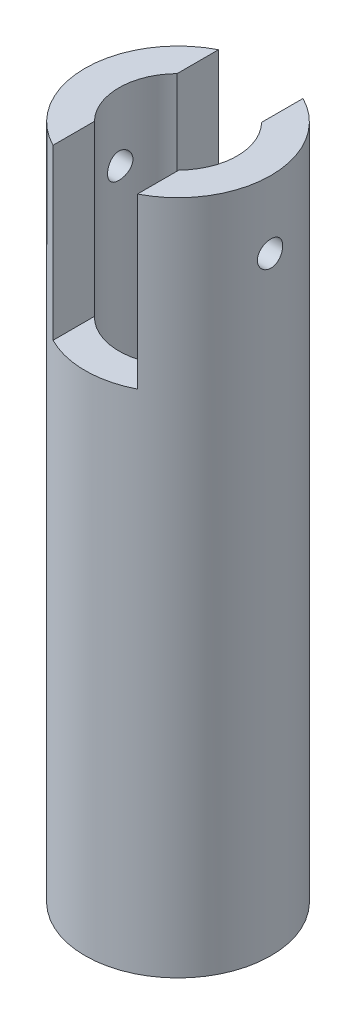
ISO-10303-21;
HEADER;
FILE_DESCRIPTION(('STEP AP214'),'2;1');
FILE_NAME('part.step','',(''),(''),'','','');
FILE_SCHEMA(('AUTOMOTIVE_DESIGN { 1 0 10303 214 1 1 1 1 }'));
ENDSEC;
DATA;
#1=APPLICATION_CONTEXT('core data for automotive mechanical design processes');
#2=APPLICATION_PROTOCOL_DEFINITION('international standard','automotive_design',2000,#1);
#3=PRODUCT_CONTEXT('',#1,'mechanical');
#4=PRODUCT('Part','Part','',(#3));
#5=PRODUCT_RELATED_PRODUCT_CATEGORY('part','',(#4));
#6=PRODUCT_DEFINITION_FORMATION('','',#4);
#7=PRODUCT_DEFINITION_CONTEXT('part definition',#1,'design');
#8=PRODUCT_DEFINITION('design','',#6,#7);
#9=PRODUCT_DEFINITION_SHAPE('','',#8);
#10=(LENGTH_UNIT() NAMED_UNIT(*) SI_UNIT(.MILLI.,.METRE.));
#11=(NAMED_UNIT(*) PLANE_ANGLE_UNIT() SI_UNIT($,.RADIAN.));
#12=(NAMED_UNIT(*) SI_UNIT($,.STERADIAN.) SOLID_ANGLE_UNIT());
#13=UNCERTAINTY_MEASURE_WITH_UNIT(LENGTH_MEASURE(1.E-05),#10,'distance_accuracy_value','');
#14=(GEOMETRIC_REPRESENTATION_CONTEXT(3) GLOBAL_UNCERTAINTY_ASSIGNED_CONTEXT((#13)) GLOBAL_UNIT_ASSIGNED_CONTEXT((#10,
#11,#12)) REPRESENTATION_CONTEXT('',''));
#15=CARTESIAN_POINT('',(0.,0.,0.));
#16=DIRECTION('',(0.,0.,1.));
#17=DIRECTION('',(1.,0.,0.));
#18=AXIS2_PLACEMENT_3D('',#15,#16,#17);
#19=CARTESIAN_POINT('',(0.,40.,0.));
#20=DIRECTION('',(0.,-1.,0.));
#21=DIRECTION('',(0.,0.,-1.));
#22=AXIS2_PLACEMENT_3D('',#19,#20,#21);
#23=CYLINDRICAL_SURFACE('',#22,5.5);
#24=CARTESIAN_POINT('',(-5.44862367942584,36.,0.75));
#25=CARTESIAN_POINT('',(-5.44862432821228,36.0419171639454,0.749998238494786));
#26=CARTESIAN_POINT('',(-5.44911262094868,36.0838597213838,0.746474033793942));
#27=CARTESIAN_POINT('',(-5.45101204241061,36.1665752373423,0.732472326567085));
#28=CARTESIAN_POINT('',(-5.45242410767666,36.2073469650124,0.721987767323877));
#29=CARTESIAN_POINT('',(-5.45600823054313,36.2865113927571,0.694382214066334));
#30=CARTESIAN_POINT('',(-5.45817974310622,36.3249057757975,0.677265978501395));
#31=CARTESIAN_POINT('',(-5.46303743390169,36.3982709843737,0.636893590754142));
#32=CARTESIAN_POINT('',(-5.46572353156943,36.4332423445327,0.6136383994859));
#33=CARTESIAN_POINT('',(-5.4713276859861,36.4990072974926,0.561483153875197));
#34=CARTESIAN_POINT('',(-5.47424702406619,36.5297748801679,0.532550436012088));
#35=CARTESIAN_POINT('',(-5.47997724063161,36.5860339028428,0.469931862967251));
#36=CARTESIAN_POINT('',(-5.48278811347474,36.6115250686712,0.436245760944884));
#37=CARTESIAN_POINT('',(-5.48799794558333,36.6566022024483,0.364911683410708));
#38=CARTESIAN_POINT('',(-5.49039523330412,36.676164438286,0.327248578727866));
#39=CARTESIAN_POINT('',(-5.49449365219496,36.7086762840544,0.24913338990555));
#40=CARTESIAN_POINT('',(-5.49619481391624,36.7216261841903,0.208681428253149));
#41=CARTESIAN_POINT('',(-5.49870027402042,36.740467515983,0.126403756906851));
#42=CARTESIAN_POINT('',(-5.49951008477627,36.7464023479257,0.0845881563006048));
#43=CARTESIAN_POINT('',(-5.50016045400814,36.751179690482,0.000547254974664131));
#44=CARTESIAN_POINT('',(-5.50000105743634,36.7500225300248,-0.0416780266531836));
#45=CARTESIAN_POINT('',(-5.49873540733172,36.7406832862068,-0.125044033523871));
#46=CARTESIAN_POINT('',(-5.49763544605483,36.7325478852421,-0.166190097475307));
#47=CARTESIAN_POINT('',(-5.49461929041563,36.7095561994921,-0.246527492164893));
#48=CARTESIAN_POINT('',(-5.49270307809629,36.6946997668479,-0.285718779877973));
#49=CARTESIAN_POINT('',(-5.48825888114084,36.6586388987551,-0.361177250541707));
#50=CARTESIAN_POINT('',(-5.48572897741787,36.6374144996032,-0.397434775412503));
#51=CARTESIAN_POINT('',(-5.48033997739527,36.5892347252735,-0.46589116485084));
#52=CARTESIAN_POINT('',(-5.47748086315112,36.5622790376287,-0.498089807977671));
#53=CARTESIAN_POINT('',(-5.47172549288364,36.5031409970398,-0.557789097807124));
#54=CARTESIAN_POINT('',(-5.4688291238894,36.4709179262455,-0.585249414208928));
#55=CARTESIAN_POINT('',(-5.46334851083837,36.4022990203316,-0.634378465191468));
#56=CARTESIAN_POINT('',(-5.46076426812632,36.3659031672356,-0.656047174820568));
#57=CARTESIAN_POINT('',(-5.4562005774764,36.2899332745995,-0.692981572825315));
#58=CARTESIAN_POINT('',(-5.45422147211024,36.2503574508078,-0.708243636178043));
#59=CARTESIAN_POINT('',(-5.45109853836438,36.1691714847138,-0.731893674041885));
#60=CARTESIAN_POINT('',(-5.44995466175976,36.1275614600113,-0.740282045433559));
#61=CARTESIAN_POINT('',(-5.44864067222812,36.0438455782465,-0.749892354180297));
#62=CARTESIAN_POINT('',(-5.44846282324423,36.0017463741903,-0.751171227137242));
#63=CARTESIAN_POINT('',(-5.44908053291778,35.9179342910334,-0.746676830732748));
#64=CARTESIAN_POINT('',(-5.4498760667662,35.876221402114,-0.740903741107735));
#65=CARTESIAN_POINT('',(-5.45234382679086,35.7945391337106,-0.722517388634435));
#66=CARTESIAN_POINT('',(-5.45401247449059,35.7545633536269,-0.709932038780938));
#67=CARTESIAN_POINT('',(-5.45803552731522,35.6772891376851,-0.678307280784331));
#68=CARTESIAN_POINT('',(-5.46038996081854,35.6399908127021,-0.659267605550156));
#69=CARTESIAN_POINT('',(-5.46553770194495,35.5688736968887,-0.615136060523287));
#70=CARTESIAN_POINT('',(-5.46833366386318,35.5350781419368,-0.590007061362654));
#71=CARTESIAN_POINT('',(-5.4740412458354,35.4721637487828,-0.534462296366743));
#72=CARTESIAN_POINT('',(-5.47695287125968,35.4430451280496,-0.504046284831928));
#73=CARTESIAN_POINT('',(-5.48258766100113,35.3901092365953,-0.43854129372568));
#74=CARTESIAN_POINT('',(-5.48530940289262,35.3663295177688,-0.403421827621339));
#75=CARTESIAN_POINT('',(-5.49023614004829,35.3250070554806,-0.329653908910437));
#76=CARTESIAN_POINT('',(-5.49244114738441,35.3074641663095,-0.291005538775303));
#77=CARTESIAN_POINT('',(-5.49607969494058,35.2791744870357,-0.211398404265973));
#78=CARTESIAN_POINT('',(-5.49751563888312,35.2684065031768,-0.170447285887151));
#79=CARTESIAN_POINT('',(-5.49946429827437,35.2539034961619,-0.0872972814052518));
#80=CARTESIAN_POINT('',(-5.4999770636871,35.2501680923902,-0.0450984629555074));
#81=CARTESIAN_POINT('',(-5.50002124174464,35.2498443336144,0.0389834861984452));
#82=CARTESIAN_POINT('',(-5.4995605780852,35.2531982715587,0.0808664021367507));
#83=CARTESIAN_POINT('',(-5.49772550186329,35.2668351328193,0.163467131876106));
#84=CARTESIAN_POINT('',(-5.4963510908427,35.2771180444435,0.204184947643066));
#85=CARTESIAN_POINT('',(-5.49284222198332,35.3043017963978,0.283288469414655));
#86=CARTESIAN_POINT('',(-5.49070814360522,35.3211993330825,0.321675328567206));
#87=CARTESIAN_POINT('',(-5.4859154179771,35.3611266511202,0.395077898212851));
#88=CARTESIAN_POINT('',(-5.48325675974811,35.3841565608219,0.430093538126579));
#89=CARTESIAN_POINT('',(-5.47768532661291,35.4359063933612,0.496053682151111));
#90=CARTESIAN_POINT('',(-5.47477073786026,35.4646691339803,0.526964442343851));
#91=CARTESIAN_POINT('',(-5.46903000129062,35.5269784389954,0.583542371196155));
#92=CARTESIAN_POINT('',(-5.46620387448299,35.5605261294432,0.609208302111163));
#93=CARTESIAN_POINT('',(-5.46094615595882,35.631632423343,0.654671533451965));
#94=CARTESIAN_POINT('',(-5.45851643956207,35.6692087729144,0.674441285541157));
#95=CARTESIAN_POINT('',(-5.45434859208448,35.747161896175,0.707360730002458));
#96=CARTESIAN_POINT('',(-5.45260972408103,35.7875356316144,0.720517480406806));
#97=CARTESIAN_POINT('',(-5.45043388216463,35.8567556991195,0.736758008064999));
#98=CARTESIAN_POINT('',(-5.44975853008098,35.8851691055984,0.7417164194638));
#99=CARTESIAN_POINT('',(-5.44885320789078,35.9423843442811,0.748338004828136));
#100=CARTESIAN_POINT('',(-5.44862323345052,35.9711861727027,0.750001210857374));
#101=CARTESIAN_POINT('',(-5.44862367942584,36.,0.75));
#102=B_SPLINE_CURVE_WITH_KNOTS('',3,(#24,#25,#26,#27,#28,#29,#30,#31,#32,#33,#34,#35,#36,#37,
#38,#39,#40,#41,#42,#43,#44,#45,#46,#47,#48,#49,#50,#51,#52,#53,#54,#55,#56,#57,#58,#59,#60,#61,
#62,#63,#64,#65,#66,#67,#68,#69,#70,#71,#72,#73,#74,#75,#76,#77,#78,#79,#80,#81,#82,#83,#84,#85,
#86,#87,#88,#89,#90,#91,#92,#93,#94,#95,#96,#97,#98,#99,#100,#101),.UNSPECIFIED.,.T.,.F.,(4,2,2,
2,2,2,2,2,2,2,2,2,2,2,2,2,2,2,2,2,2,2,2,2,2,2,2,2,2,2,2,2,2,2,2,2,2,2,4),(0.,0.125646206826185,
0.25141999430737,0.377103701527226,0.502767747470541,0.629177150874036,0.755593121066162,
0.882508617622696,1.00941854357567,1.13553913352513,1.26165387399972,1.38693146536708,
1.51221181290698,1.6378890953218,1.7635732313566,1.89027935655859,2.0169860276323,
2.14376429583517,2.27053524346326,2.39628948188411,2.52204051521907,2.64728014611423,
2.77252496027315,2.89855356459824,3.02458802732691,3.15148298083582,3.27837496953451,
3.40486800549967,3.5313541952376,3.65681475740462,3.78227510786556,3.90767287748694,
4.03307327184753,4.15944795111646,4.28585241960836,4.41283854629708,4.53968885183256,
4.62605880130635,4.71242791036092),.UNSPECIFIED.);
#103=CARTESIAN_POINT('',(-5.44862367942584,36.,0.75));
#104=VERTEX_POINT('',#103);
#105=EDGE_CURVE('E183',#104,#104,#102,.T.);
#106=ORIENTED_EDGE('',*,*,#105,.F.);
#107=EDGE_LOOP('',(#106));
#108=FACE_BOUND('',#107,.T.);
#109=CARTESIAN_POINT('',(0.,0.,0.));
#110=DIRECTION('',(0.,1.,0.));
#111=DIRECTION('',(0.,0.,1.));
#112=AXIS2_PLACEMENT_3D('',#109,#110,#111);
#113=CIRCLE('',#112,5.5);
#114=CARTESIAN_POINT('',(0.,0.,5.5));
#115=VERTEX_POINT('',#114);
#116=EDGE_CURVE('E146',#115,#115,#113,.T.);
#117=ORIENTED_EDGE('',*,*,#116,.T.);
#118=EDGE_LOOP('',(#117));
#119=FACE_BOUND('',#118,.T.);
#120=DIRECTION('',(0.,-1.,0.));
#121=VECTOR('',#120,1.);
#122=CARTESIAN_POINT('',(2.5,40.,-4.89897948556636));
#123=LINE('',#122,#121);
#124=CARTESIAN_POINT('',(2.5,40.,-4.89897948556636));
#125=VERTEX_POINT('',#124);
#126=CARTESIAN_POINT('',(2.5,30.,-4.89897948556636));
#127=VERTEX_POINT('',#126);
#128=EDGE_CURVE('E140',#125,#127,#123,.T.);
#129=ORIENTED_EDGE('',*,*,#128,.F.);
#130=CARTESIAN_POINT('',(0.,40.,0.));
#131=DIRECTION('',(0.,1.,0.));
#132=DIRECTION('',(0.,0.,1.));
#133=AXIS2_PLACEMENT_3D('',#130,#131,#132);
#134=CIRCLE('',#133,5.5);
#135=CARTESIAN_POINT('',(2.5,40.,4.89897948556636));
#136=VERTEX_POINT('',#135);
#137=EDGE_CURVE('E150',#136,#125,#134,.T.);
#138=ORIENTED_EDGE('',*,*,#137,.F.);
#139=DIRECTION('',(0.,-1.,0.));
#140=VECTOR('',#139,1.);
#141=CARTESIAN_POINT('',(2.5,40.,4.89897948556636));
#142=LINE('',#141,#140);
#143=CARTESIAN_POINT('',(2.5,30.,4.89897948556636));
#144=VERTEX_POINT('',#143);
#145=EDGE_CURVE('E137',#144,#136,#142,.F.);
#146=ORIENTED_EDGE('',*,*,#145,.F.);
#147=CARTESIAN_POINT('',(0.,30.,0.));
#148=DIRECTION('',(0.,-1.,0.));
#149=DIRECTION('',(0.,0.,-1.));
#150=AXIS2_PLACEMENT_3D('',#147,#148,#149);
#151=CIRCLE('',#150,5.5);
#152=CARTESIAN_POINT('',(-2.50000000000001,30.,4.89897948556635));
#153=VERTEX_POINT('',#152);
#154=EDGE_CURVE('E116',#144,#153,#151,.T.);
#155=ORIENTED_EDGE('',*,*,#154,.T.);
#156=DIRECTION('',(0.,-1.,0.));
#157=VECTOR('',#156,1.);
#158=CARTESIAN_POINT('',(-2.50000000000001,40.,4.89897948556635));
#159=LINE('',#158,#157);
#160=CARTESIAN_POINT('',(-2.50000000000001,40.,4.89897948556635));
#161=VERTEX_POINT('',#160);
#162=EDGE_CURVE('E129',#153,#161,#159,.F.);
#163=ORIENTED_EDGE('',*,*,#162,.T.);
#164=CARTESIAN_POINT('',(-2.50000000000001,40.,-4.89897948556635));
#165=VERTEX_POINT('',#164);
#166=EDGE_CURVE('E127',#165,#161,#134,.T.);
#167=ORIENTED_EDGE('',*,*,#166,.F.);
#168=DIRECTION('',(0.,-1.,0.));
#169=VECTOR('',#168,1.);
#170=CARTESIAN_POINT('',(-2.50000000000001,40.,-4.89897948556635));
#171=LINE('',#170,#169);
#172=CARTESIAN_POINT('',(-2.50000000000001,30.,-4.89897948556635));
#173=VERTEX_POINT('',#172);
#174=EDGE_CURVE('E117',#165,#173,#171,.T.);
#175=ORIENTED_EDGE('',*,*,#174,.T.);
#176=EDGE_CURVE('E106',#173,#127,#151,.T.);
#177=ORIENTED_EDGE('',*,*,#176,.T.);
#178=EDGE_LOOP('',(#129,#138,#146,#155,#163,#167,#175,#177));
#179=FACE_BOUND('',#178,.T.);
#180=CARTESIAN_POINT('',(5.44862367942584,36.,0.75));
#181=CARTESIAN_POINT('',(5.44862432821228,35.9580828360546,0.749998238494786));
#182=CARTESIAN_POINT('',(5.44911262094868,35.9161402786163,0.746474033793942));
#183=CARTESIAN_POINT('',(5.45101204241061,35.8334247626577,0.732472326567085));
#184=CARTESIAN_POINT('',(5.45242410767666,35.7926530349876,0.721987767323877));
#185=CARTESIAN_POINT('',(5.45600823054313,35.7134886072429,0.694382214066334));
#186=CARTESIAN_POINT('',(5.45817974310622,35.6750942242025,0.677265978501395));
#187=CARTESIAN_POINT('',(5.46303743390169,35.6017290156263,0.636893590754142));
#188=CARTESIAN_POINT('',(5.46572353156943,35.5667576554673,0.613638399485901));
#189=CARTESIAN_POINT('',(5.4713276859861,35.5009927025074,0.561483153875196));
#190=CARTESIAN_POINT('',(5.47424702406619,35.4702251198321,0.532550436012085));
#191=CARTESIAN_POINT('',(5.47997724063161,35.4139660971572,0.469931862967248));
#192=CARTESIAN_POINT('',(5.48278811347474,35.3884749313288,0.436245760944882));
#193=CARTESIAN_POINT('',(5.48799794558333,35.3433977975517,0.364911683410709));
#194=CARTESIAN_POINT('',(5.49039523330412,35.323835561714,0.327248578727867));
#195=CARTESIAN_POINT('',(5.49449365219496,35.2913237159456,0.24913338990555));
#196=CARTESIAN_POINT('',(5.49619481391624,35.2783738158097,0.208681428253149));
#197=CARTESIAN_POINT('',(5.49870027402042,35.259532484017,0.12640375690685));
#198=CARTESIAN_POINT('',(5.49951008477627,35.2535976520743,0.0845881563006046));
#199=CARTESIAN_POINT('',(5.50016045400814,35.248820309518,0.00054725497466386));
#200=CARTESIAN_POINT('',(5.50000105743634,35.2499774699752,-0.0416780266531837));
#201=CARTESIAN_POINT('',(5.49873540733172,35.2593167137932,-0.125044033523871));
#202=CARTESIAN_POINT('',(5.49763544605483,35.2674521147579,-0.166190097475307));
#203=CARTESIAN_POINT('',(5.49461929041563,35.2904438005079,-0.246527492164893));
#204=CARTESIAN_POINT('',(5.49270307809629,35.3053002331521,-0.285718779877973));
#205=CARTESIAN_POINT('',(5.48825888114084,35.3413611012449,-0.361177250541707));
#206=CARTESIAN_POINT('',(5.48572897741787,35.3625855003968,-0.397434775412503));
#207=CARTESIAN_POINT('',(5.48033997739527,35.4107652747265,-0.46589116485084));
#208=CARTESIAN_POINT('',(5.47748086315112,35.4377209623713,-0.498089807977671));
#209=CARTESIAN_POINT('',(5.47172549288364,35.4968590029602,-0.557789097807124));
#210=CARTESIAN_POINT('',(5.4688291238894,35.5290820737545,-0.585249414208928));
#211=CARTESIAN_POINT('',(5.46334851083837,35.5977009796684,-0.634378465191468));
#212=CARTESIAN_POINT('',(5.46076426812632,35.6340968327644,-0.656047174820568));
#213=CARTESIAN_POINT('',(5.4562005774764,35.7100667254005,-0.692981572825315));
#214=CARTESIAN_POINT('',(5.45422147211024,35.7496425491922,-0.708243636178043));
#215=CARTESIAN_POINT('',(5.45109853836438,35.8308285152862,-0.731893674041885));
#216=CARTESIAN_POINT('',(5.44995466175976,35.8724385399887,-0.740282045433559));
#217=CARTESIAN_POINT('',(5.44864067222812,35.9561544217535,-0.749892354180297));
#218=CARTESIAN_POINT('',(5.44846282324423,35.9982536258098,-0.751171227137242));
#219=CARTESIAN_POINT('',(5.44908053291778,36.0820657089666,-0.746676830732748));
#220=CARTESIAN_POINT('',(5.4498760667662,36.123778597886,-0.740903741107735));
#221=CARTESIAN_POINT('',(5.45234382679086,36.2054608662894,-0.722517388634435));
#222=CARTESIAN_POINT('',(5.45401247449059,36.2454366463731,-0.709932038780937));
#223=CARTESIAN_POINT('',(5.45803552731522,36.3227108623149,-0.678307280784331));
#224=CARTESIAN_POINT('',(5.46038996081853,36.3600091872979,-0.659267605550156));
#225=CARTESIAN_POINT('',(5.46553770194495,36.4311263031114,-0.615136060523288));
#226=CARTESIAN_POINT('',(5.46833366386318,36.4649218580632,-0.590007061362656));
#227=CARTESIAN_POINT('',(5.4740412458354,36.5278362512172,-0.534462296366745));
#228=CARTESIAN_POINT('',(5.47695287125968,36.5569548719504,-0.50404628483193));
#229=CARTESIAN_POINT('',(5.48258766100113,36.6098907634047,-0.438541293725679));
#230=CARTESIAN_POINT('',(5.48530940289262,36.6336704822312,-0.403421827621336));
#231=CARTESIAN_POINT('',(5.49023614004829,36.6749929445194,-0.329653908910433));
#232=CARTESIAN_POINT('',(5.49244114738441,36.6925358336905,-0.291005538775301));
#233=CARTESIAN_POINT('',(5.49607969494058,36.7208255129643,-0.211398404265972));
#234=CARTESIAN_POINT('',(5.49751563888312,36.7315934968232,-0.170447285887151));
#235=CARTESIAN_POINT('',(5.49946429827437,36.7460965038381,-0.0872972814052519));
#236=CARTESIAN_POINT('',(5.4999770636871,36.7498319076098,-0.0450984629555075));
#237=CARTESIAN_POINT('',(5.50002124174464,36.7501556663856,0.0389834861984452));
#238=CARTESIAN_POINT('',(5.4995605780852,36.7468017284414,0.0808664021367507));
#239=CARTESIAN_POINT('',(5.49772550186329,36.7331648671807,0.163467131876106));
#240=CARTESIAN_POINT('',(5.4963510908427,36.7228819555565,0.204184947643066));
#241=CARTESIAN_POINT('',(5.49284222198332,36.6956982036022,0.283288469414654));
#242=CARTESIAN_POINT('',(5.49070814360522,36.6788006669176,0.321675328567204));
#243=CARTESIAN_POINT('',(5.4859154179771,36.6388733488798,0.395077898212849));
#244=CARTESIAN_POINT('',(5.48325675974811,36.6158434391781,0.430093538126579));
#245=CARTESIAN_POINT('',(5.47768532661291,36.5640936066388,0.496053682151112));
#246=CARTESIAN_POINT('',(5.47477073786026,36.5353308660197,0.526964442343853));
#247=CARTESIAN_POINT('',(5.46903000129062,36.4730215610046,0.583542371196157));
#248=CARTESIAN_POINT('',(5.46620387448299,36.4394738705568,0.609208302111164));
#249=CARTESIAN_POINT('',(5.46094615595882,36.368367576657,0.654671533451966));
#250=CARTESIAN_POINT('',(5.45851643956207,36.3307912270856,0.674441285541157));
#251=CARTESIAN_POINT('',(5.45434859208448,36.252838103825,0.707360730002458));
#252=CARTESIAN_POINT('',(5.45260972408103,36.2124643683856,0.720517480406806));
#253=CARTESIAN_POINT('',(5.45043388216463,36.1432443008806,0.736758008064999));
#254=CARTESIAN_POINT('',(5.44975853008098,36.1148308944016,0.7417164194638));
#255=CARTESIAN_POINT('',(5.44885320789078,36.0576156557189,0.748338004828136));
#256=CARTESIAN_POINT('',(5.44862323345052,36.0288138272974,0.750001210857374));
#257=CARTESIAN_POINT('',(5.44862367942584,36.,0.75));
#258=B_SPLINE_CURVE_WITH_KNOTS('',3,(#180,#181,#182,#183,#184,#185,#186,#187,#188,#189,#190,
#191,#192,#193,#194,#195,#196,#197,#198,#199,#200,#201,#202,#203,#204,#205,#206,#207,#208,#209,
#210,#211,#212,#213,#214,#215,#216,#217,#218,#219,#220,#221,#222,#223,#224,#225,#226,#227,#228,
#229,#230,#231,#232,#233,#234,#235,#236,#237,#238,#239,#240,#241,#242,#243,#244,#245,#246,#247,
#248,#249,#250,#251,#252,#253,#254,#255,#256,#257),.UNSPECIFIED.,.T.,.F.,(4,2,2,2,2,2,2,2,2,2,2,
2,2,2,2,2,2,2,2,2,2,2,2,2,2,2,2,2,2,2,2,2,2,2,2,2,2,2,4),(0.,0.125646206826185,0.25141999430737,
0.377103701527226,0.502767747470541,0.629177150874038,0.755593121066161,0.882508617622696,
1.00941854357567,1.13553913352513,1.26165387399972,1.38693146536708,1.51221181290698,
1.6378890953218,1.7635732313566,1.89027935655859,2.0169860276323,2.14376429583517,
2.27053524346326,2.3962894818841,2.52204051521907,2.64728014611423,2.77252496027315,
2.89855356459823,3.02458802732691,3.15148298083583,3.27837496953451,3.40486800549967,
3.5313541952376,3.65681475740461,3.78227510786556,3.90767287748693,4.03307327184753,
4.15944795111646,4.28585241960836,4.41283854629708,4.53968885183256,4.62605880130635,
4.71242791036092),.UNSPECIFIED.);
#259=CARTESIAN_POINT('',(5.44862367942584,36.,0.75));
#260=VERTEX_POINT('',#259);
#261=EDGE_CURVE('E187',#260,#260,#258,.T.);
#262=ORIENTED_EDGE('',*,*,#261,.F.);
#263=EDGE_LOOP('',(#262));
#264=FACE_BOUND('',#263,.T.);
#265=ADVANCED_FACE('F34',(#108,#119,#179,#264),#23,.T.);
#266=CARTESIAN_POINT('',(0.,40.,0.));
#267=DIRECTION('',(0.,-1.,0.));
#268=DIRECTION('',(0.,0.,-1.));
#269=AXIS2_PLACEMENT_3D('',#266,#267,#268);
#270=CYLINDRICAL_SURFACE('',#269,3.5);
#271=CARTESIAN_POINT('',(-3.41869858279434,36.,0.75));
#272=CARTESIAN_POINT('',(-3.41869942294351,36.0416055762336,0.749998541194088));
#273=CARTESIAN_POINT('',(-3.41946636233665,36.0832288869482,0.746526181228762));
#274=CARTESIAN_POINT('',(-3.42244589278789,36.1652933360997,0.732742796269729));
#275=CARTESIAN_POINT('',(-3.42465955623036,36.2057335743339,0.722426698268707));
#276=CARTESIAN_POINT('',(-3.43027057629631,36.2842328747946,0.695294318421271));
#277=CARTESIAN_POINT('',(-3.43366666358336,36.3222944390628,0.678485004956109));
#278=CARTESIAN_POINT('',(-3.44125835428899,36.3950576369703,0.638863088367165));
#279=CARTESIAN_POINT('',(-3.44545393440007,36.429759368514,0.616050660244003));
#280=CARTESIAN_POINT('',(-3.45424789397074,36.4953814807416,0.564675712850976));
#281=CARTESIAN_POINT('',(-3.45885124935541,36.5262394381201,0.536034297419878));
#282=CARTESIAN_POINT('',(-3.46789845855534,36.5827517772028,0.47398475406482));
#283=CARTESIAN_POINT('',(-3.47234230025799,36.60840576443,0.440576265108845));
#284=CARTESIAN_POINT('',(-3.48062384554625,36.6540277222458,0.369523644232281));
#285=CARTESIAN_POINT('',(-3.4844549940969,36.6739358278853,0.331840244114973));
#286=CARTESIAN_POINT('',(-3.49102335521491,36.7071138457231,0.2535671346713));
#287=CARTESIAN_POINT('',(-3.49376068551671,36.7203844723931,0.212977738690157));
#288=CARTESIAN_POINT('',(-3.49779782640584,36.7397149854657,0.130693593835755));
#289=CARTESIAN_POINT('',(-3.49911866689191,36.7458804642762,0.0890247002984614));
#290=CARTESIAN_POINT('',(-3.50024681103503,36.7511556386566,0.0052244726533221));
#291=CARTESIAN_POINT('',(-3.5000542811635,36.7502661102804,-0.0369068100823801));
#292=CARTESIAN_POINT('',(-3.49819350431279,36.7415355176682,-0.119708514625257));
#293=CARTESIAN_POINT('',(-3.49654941576216,36.733808249855,-0.160391557681057));
#294=CARTESIAN_POINT('',(-3.49199770794552,36.7118026590741,-0.239869731989196));
#295=CARTESIAN_POINT('',(-3.48909003308259,36.6975240478501,-0.278664780087528));
#296=CARTESIAN_POINT('',(-3.48229877323429,36.6627192705557,-0.353583748778279));
#297=CARTESIAN_POINT('',(-3.47840842901973,36.6421496163978,-0.389686828507899));
#298=CARTESIAN_POINT('',(-3.47007896871932,36.5953790159182,-0.457970463281427));
#299=CARTESIAN_POINT('',(-3.46563978072347,36.5691773313498,-0.490150503225766));
#300=CARTESIAN_POINT('',(-3.45659663230462,36.5112657277361,-0.550351044000991));
#301=CARTESIAN_POINT('',(-3.45199115186426,36.4794562103215,-0.578275586601254));
#302=CARTESIAN_POINT('',(-3.44321783415987,36.4115583574658,-0.628411216173642));
#303=CARTESIAN_POINT('',(-3.43905000781693,36.3754699152974,-0.650622160590344));
#304=CARTESIAN_POINT('',(-3.43162011793361,36.2998877494681,-0.688740387866485));
#305=CARTESIAN_POINT('',(-3.42836057563888,36.2603849380738,-0.704630175444615));
#306=CARTESIAN_POINT('',(-3.42315170403308,36.1791836170268,-0.729517475795579));
#307=CARTESIAN_POINT('',(-3.42120217609241,36.1374854412784,-0.73851603347314));
#308=CARTESIAN_POINT('',(-3.41887440627723,36.0539521236751,-0.749217930123261));
#309=CARTESIAN_POINT('',(-3.41846613525851,36.0121356624613,-0.751060709643201));
#310=CARTESIAN_POINT('',(-3.41918619786997,35.9287930034092,-0.747775698211867));
#311=CARTESIAN_POINT('',(-3.42031443050531,35.8872667866732,-0.742648365408176));
#312=CARTESIAN_POINT('',(-3.42395207742103,35.8061647825096,-0.725689473177921));
#313=CARTESIAN_POINT('',(-3.42644577637182,35.7665722837015,-0.713934151257767));
#314=CARTESIAN_POINT('',(-3.43251929934889,35.6899188312335,-0.684135264733746));
#315=CARTESIAN_POINT('',(-3.43609922386425,35.6528581121829,-0.666091118314091));
#316=CARTESIAN_POINT('',(-3.44400817040173,35.5817151576205,-0.623917522083525));
#317=CARTESIAN_POINT('',(-3.44834750873158,35.5476852089939,-0.59970184295396));
#318=CARTESIAN_POINT('',(-3.4572588768007,35.4841208270631,-0.545985919168002));
#319=CARTESIAN_POINT('',(-3.46183093417231,35.4545869292758,-0.516485045910805));
#320=CARTESIAN_POINT('',(-3.47079119995087,35.4003148485276,-0.452406382210406));
#321=CARTESIAN_POINT('',(-3.47517467803873,35.3756715419215,-0.417747462914383));
#322=CARTESIAN_POINT('',(-3.48317805357451,35.3325572953245,-0.344700740641134));
#323=CARTESIAN_POINT('',(-3.48679798588346,35.3140860735136,-0.306313108021867));
#324=CARTESIAN_POINT('',(-3.49284639190787,35.2839739726808,-0.227132709491018));
#325=CARTESIAN_POINT('',(-3.49528221901849,35.2722908481269,-0.186356596537585));
#326=CARTESIAN_POINT('',(-3.4987196965099,35.2559541471338,-0.103362588501644));
#327=CARTESIAN_POINT('',(-3.49972154656148,35.251299592013,-0.0611448949869944));
#328=CARTESIAN_POINT('',(-3.50017255504528,35.2491946737941,0.0226318585264172));
#329=CARTESIAN_POINT('',(-3.49965229500834,35.2516024206977,0.0641872527546168));
#330=CARTESIAN_POINT('',(-3.49718276181691,35.2632373817595,0.146286469207982));
#331=CARTESIAN_POINT('',(-3.49523351236842,35.2724644827892,0.186830308202644));
#332=CARTESIAN_POINT('',(-3.49012694319269,35.2974094031248,0.265650974243636));
#333=CARTESIAN_POINT('',(-3.48697323215248,35.3131078446928,0.303934182536589));
#334=CARTESIAN_POINT('',(-3.47979518025329,35.3505306355846,0.377342478361611));
#335=CARTESIAN_POINT('',(-3.47577075860164,35.372255544153,0.412467272398072));
#336=CARTESIAN_POINT('',(-3.46719904967253,35.4215811593713,0.479256153447626));
#337=CARTESIAN_POINT('',(-3.4626435445396,35.4492820791607,0.510845182552893));
#338=CARTESIAN_POINT('',(-3.45356845037895,35.5095703051252,0.568975007288215));
#339=CARTESIAN_POINT('',(-3.44904887022753,35.5421587816778,0.595514590312104));
#340=CARTESIAN_POINT('',(-3.44049346826046,35.6117952465928,0.643116307983383));
#341=CARTESIAN_POINT('',(-3.43646452978599,35.6488946791434,0.664104489048108));
#342=CARTESIAN_POINT('',(-3.42943248613692,35.7261718604617,0.699515023299105));
#343=CARTESIAN_POINT('',(-3.42642849789546,35.7663469226269,0.71394303211957));
#344=CARTESIAN_POINT('',(-3.42235280321944,35.8388130655927,0.733193035607853));
#345=CARTESIAN_POINT('',(-3.42099141547116,35.8707058378531,0.739483762538933));
#346=CARTESIAN_POINT('',(-3.41916399749064,35.9350621557894,0.747887720216971));
#347=CARTESIAN_POINT('',(-3.41869792703424,35.967525675757,0.750001138639108));
#348=CARTESIAN_POINT('',(-3.41869858279434,36.,0.75));
#349=B_SPLINE_CURVE_WITH_KNOTS('',3,(#271,#272,#273,#274,#275,#276,#277,#278,#279,#280,#281,
#282,#283,#284,#285,#286,#287,#288,#289,#290,#291,#292,#293,#294,#295,#296,#297,#298,#299,#300,
#301,#302,#303,#304,#305,#306,#307,#308,#309,#310,#311,#312,#313,#314,#315,#316,#317,#318,#319,
#320,#321,#322,#323,#324,#325,#326,#327,#328,#329,#330,#331,#332,#333,#334,#335,#336,#337,#338,
#339,#340,#341,#342,#343,#344,#345,#346,#347,#348),.UNSPECIFIED.,.T.,.F.,(4,2,2,2,2,2,2,2,2,2,2,
2,2,2,2,2,2,2,2,2,2,2,2,2,2,2,2,2,2,2,2,2,2,2,2,2,2,2,4),(0.,0.124697741002731,
0.249488019218578,0.374144745554977,0.498797838346241,0.625266147892058,0.751744040542987,
0.879495674079987,1.00723355320993,1.13304754073824,1.2588476888648,1.38259278831546,
1.50634333301652,1.63096944069579,1.75561189434017,1.88274480387507,2.00988088509406,
2.1373664370375,2.26483265474779,2.38980216594121,2.51476346324818,2.63831590372548,
2.76187977779435,2.88727505106018,3.01268524827399,3.14033107339465,3.26797106935631,
3.39480794910047,3.52162716602129,3.64591599819923,3.7702027685541,3.89412004807601,
4.01804883073543,4.14424457078342,4.27047057813477,4.39830190081484,4.52602280803704,
4.62335728058996,4.72068738006871),.UNSPECIFIED.);
#350=CARTESIAN_POINT('',(-3.41869858279434,36.,0.75));
#351=VERTEX_POINT('',#350);
#352=EDGE_CURVE('E162',#351,#351,#349,.T.);
#353=ORIENTED_EDGE('',*,*,#352,.T.);
#354=EDGE_LOOP('',(#353));
#355=FACE_BOUND('',#354,.T.);
#356=CARTESIAN_POINT('',(0.,0.,0.));
#357=DIRECTION('',(0.,1.,0.));
#358=DIRECTION('',(0.,0.,1.));
#359=AXIS2_PLACEMENT_3D('',#356,#357,#358);
#360=CIRCLE('',#359,3.5);
#361=CARTESIAN_POINT('',(0.,0.,3.5));
#362=VERTEX_POINT('',#361);
#363=EDGE_CURVE('E142',#362,#362,#360,.T.);
#364=ORIENTED_EDGE('',*,*,#363,.F.);
#365=EDGE_LOOP('',(#364));
#366=FACE_BOUND('',#365,.T.);
#367=CARTESIAN_POINT('',(0.,40.,0.));
#368=DIRECTION('',(0.,1.,0.));
#369=DIRECTION('',(0.,0.,1.));
#370=AXIS2_PLACEMENT_3D('',#367,#368,#369);
#371=CIRCLE('',#370,3.5);
#372=CARTESIAN_POINT('',(2.5,40.,2.44948974278318));
#373=VERTEX_POINT('',#372);
#374=CARTESIAN_POINT('',(2.5,40.,-2.44948974278318));
#375=VERTEX_POINT('',#374);
#376=EDGE_CURVE('E143',#373,#375,#371,.T.);
#377=ORIENTED_EDGE('',*,*,#376,.T.);
#378=DIRECTION('',(0.,-1.,0.));
#379=VECTOR('',#378,1.);
#380=CARTESIAN_POINT('',(2.5,40.,-2.44948974278318));
#381=LINE('',#380,#379);
#382=CARTESIAN_POINT('',(2.5,30.,-2.44948974278318));
#383=VERTEX_POINT('',#382);
#384=EDGE_CURVE('E11',#375,#383,#381,.T.);
#385=ORIENTED_EDGE('',*,*,#384,.T.);
#386=CARTESIAN_POINT('',(0.,30.,0.));
#387=DIRECTION('',(0.,-1.,0.));
#388=DIRECTION('',(0.,0.,-1.));
#389=AXIS2_PLACEMENT_3D('',#386,#387,#388);
#390=CIRCLE('',#389,3.5);
#391=CARTESIAN_POINT('',(-2.50000000000001,30.,-2.44948974278317));
#392=VERTEX_POINT('',#391);
#393=EDGE_CURVE('E47',#392,#383,#390,.T.);
#394=ORIENTED_EDGE('',*,*,#393,.F.);
#395=DIRECTION('',(0.,-1.,0.));
#396=VECTOR('',#395,1.);
#397=CARTESIAN_POINT('',(-2.50000000000001,40.,-2.44948974278317));
#398=LINE('',#397,#396);
#399=CARTESIAN_POINT('',(-2.50000000000001,40.,-2.44948974278317));
#400=VERTEX_POINT('',#399);
#401=EDGE_CURVE('E120',#400,#392,#398,.T.);
#402=ORIENTED_EDGE('',*,*,#401,.F.);
#403=CARTESIAN_POINT('',(-2.50000000000001,40.,2.44948974278317));
#404=VERTEX_POINT('',#403);
#405=EDGE_CURVE('E147',#400,#404,#371,.T.);
#406=ORIENTED_EDGE('',*,*,#405,.T.);
#407=DIRECTION('',(0.,-1.,0.));
#408=VECTOR('',#407,1.);
#409=CARTESIAN_POINT('',(-2.50000000000001,40.,2.44948974278317));
#410=LINE('',#409,#408);
#411=CARTESIAN_POINT('',(-2.50000000000001,30.,2.44948974278317));
#412=VERTEX_POINT('',#411);
#413=EDGE_CURVE('E153',#412,#404,#410,.F.);
#414=ORIENTED_EDGE('',*,*,#413,.F.);
#415=CARTESIAN_POINT('',(2.5,30.,2.44948974278318));
#416=VERTEX_POINT('',#415);
#417=EDGE_CURVE('E157',#416,#412,#390,.T.);
#418=ORIENTED_EDGE('',*,*,#417,.F.);
#419=DIRECTION('',(0.,-1.,0.));
#420=VECTOR('',#419,1.);
#421=CARTESIAN_POINT('',(2.5,40.,2.44948974278318));
#422=LINE('',#421,#420);
#423=EDGE_CURVE('E159',#416,#373,#422,.F.);
#424=ORIENTED_EDGE('',*,*,#423,.T.);
#425=EDGE_LOOP('',(#377,#385,#394,#402,#406,#414,#418,#424));
#426=FACE_BOUND('',#425,.T.);
#427=CARTESIAN_POINT('',(3.41869858279434,36.,0.75));
#428=CARTESIAN_POINT('',(3.41869942294351,35.9583944237664,0.749998541194088));
#429=CARTESIAN_POINT('',(3.41946636233665,35.9167711130518,0.746526181228762));
#430=CARTESIAN_POINT('',(3.42244589278789,35.8347066639003,0.732742796269728));
#431=CARTESIAN_POINT('',(3.42465955623036,35.7942664256661,0.722426698268707));
#432=CARTESIAN_POINT('',(3.43027057629631,35.7157671252054,0.695294318421271));
#433=CARTESIAN_POINT('',(3.43366666358336,35.6777055609373,0.678485004956109));
#434=CARTESIAN_POINT('',(3.44125835428899,35.6049423630297,0.638863088367165));
#435=CARTESIAN_POINT('',(3.44545393440007,35.570240631486,0.616050660244003));
#436=CARTESIAN_POINT('',(3.45424789397074,35.5046185192584,0.564675712850976));
#437=CARTESIAN_POINT('',(3.45885124935541,35.4737605618799,0.536034297419878));
#438=CARTESIAN_POINT('',(3.46789845855534,35.4172482227973,0.47398475406482));
#439=CARTESIAN_POINT('',(3.47234230025799,35.39159423557,0.440576265108845));
#440=CARTESIAN_POINT('',(3.48062384554625,35.3459722777542,0.369523644232281));
#441=CARTESIAN_POINT('',(3.4844549940969,35.3260641721147,0.331840244114973));
#442=CARTESIAN_POINT('',(3.49102335521491,35.2928861542769,0.2535671346713));
#443=CARTESIAN_POINT('',(3.49376068551671,35.2796155276069,0.212977738690157));
#444=CARTESIAN_POINT('',(3.49779782640584,35.2602850145343,0.130693593835755));
#445=CARTESIAN_POINT('',(3.49911866689191,35.2541195357238,0.0890247002984614));
#446=CARTESIAN_POINT('',(3.50024681103503,35.2488443613434,0.00522447265332209));
#447=CARTESIAN_POINT('',(3.5000542811635,35.2497338897196,-0.0369068100823801));
#448=CARTESIAN_POINT('',(3.49819350431279,35.2584644823318,-0.119708514625256));
#449=CARTESIAN_POINT('',(3.49654941576216,35.266191750145,-0.160391557681056));
#450=CARTESIAN_POINT('',(3.49199770794552,35.2881973409259,-0.239869731989195));
#451=CARTESIAN_POINT('',(3.48909003308259,35.3024759521499,-0.278664780087528));
#452=CARTESIAN_POINT('',(3.48229877323429,35.3372807294443,-0.353583748778279));
#453=CARTESIAN_POINT('',(3.47840842901973,35.3578503836022,-0.389686828507899));
#454=CARTESIAN_POINT('',(3.47007896871932,35.4046209840818,-0.457970463281427));
#455=CARTESIAN_POINT('',(3.46563978072347,35.4308226686502,-0.490150503225766));
#456=CARTESIAN_POINT('',(3.45659663230462,35.4887342722639,-0.550351044000991));
#457=CARTESIAN_POINT('',(3.45199115186426,35.5205437896785,-0.578275586601254));
#458=CARTESIAN_POINT('',(3.44321783415987,35.5884416425343,-0.628411216173642));
#459=CARTESIAN_POINT('',(3.43905000781693,35.6245300847026,-0.650622160590344));
#460=CARTESIAN_POINT('',(3.43162011793361,35.7001122505319,-0.688740387866485));
#461=CARTESIAN_POINT('',(3.42836057563888,35.7396150619262,-0.704630175444615));
#462=CARTESIAN_POINT('',(3.42315170403308,35.8208163829732,-0.729517475795579));
#463=CARTESIAN_POINT('',(3.42120217609241,35.8625145587216,-0.73851603347314));
#464=CARTESIAN_POINT('',(3.41887440627723,35.9460478763249,-0.749217930123261));
#465=CARTESIAN_POINT('',(3.41846613525851,35.9878643375387,-0.751060709643201));
#466=CARTESIAN_POINT('',(3.41918619786997,36.0712069965909,-0.747775698211867));
#467=CARTESIAN_POINT('',(3.42031443050531,36.1127332133268,-0.742648365408176));
#468=CARTESIAN_POINT('',(3.42395207742103,36.1938352174904,-0.725689473177921));
#469=CARTESIAN_POINT('',(3.42644577637182,36.2334277162985,-0.713934151257767));
#470=CARTESIAN_POINT('',(3.43251929934889,36.3100811687665,-0.684135264733746));
#471=CARTESIAN_POINT('',(3.43609922386425,36.3471418878171,-0.666091118314091));
#472=CARTESIAN_POINT('',(3.44400817040173,36.4182848423795,-0.623917522083525));
#473=CARTESIAN_POINT('',(3.44834750873158,36.4523147910061,-0.59970184295396));
#474=CARTESIAN_POINT('',(3.4572588768007,36.5158791729369,-0.545985919168002));
#475=CARTESIAN_POINT('',(3.46183093417231,36.5454130707242,-0.516485045910805));
#476=CARTESIAN_POINT('',(3.47079119995087,36.5996851514724,-0.452406382210406));
#477=CARTESIAN_POINT('',(3.47517467803873,36.6243284580785,-0.417747462914382));
#478=CARTESIAN_POINT('',(3.48317805357451,36.6674427046755,-0.344700740641134));
#479=CARTESIAN_POINT('',(3.48679798588346,36.6859139264864,-0.306313108021867));
#480=CARTESIAN_POINT('',(3.49284639190787,36.7160260273192,-0.227132709491018));
#481=CARTESIAN_POINT('',(3.49528221901849,36.7277091518731,-0.186356596537584));
#482=CARTESIAN_POINT('',(3.4987196965099,36.7440458528662,-0.103362588501642));
#483=CARTESIAN_POINT('',(3.49972154656148,36.748700407987,-0.0611448949869935));
#484=CARTESIAN_POINT('',(3.50017255504528,36.7508053262059,0.0226318585264172));
#485=CARTESIAN_POINT('',(3.49965229500834,36.7483975793023,0.0641872527546168));
#486=CARTESIAN_POINT('',(3.49718276181691,36.7367626182405,0.146286469207982));
#487=CARTESIAN_POINT('',(3.49523351236842,36.7275355172108,0.186830308202644));
#488=CARTESIAN_POINT('',(3.49012694319269,36.7025905968753,0.265650974243636));
#489=CARTESIAN_POINT('',(3.48697323215248,36.6868921553072,0.303934182536589));
#490=CARTESIAN_POINT('',(3.47979518025329,36.6494693644154,0.377342478361611));
#491=CARTESIAN_POINT('',(3.47577075860164,36.627744455847,0.412467272398072));
#492=CARTESIAN_POINT('',(3.46719904967253,36.5784188406287,0.479256153447626));
#493=CARTESIAN_POINT('',(3.4626435445396,36.5507179208394,0.510845182552893));
#494=CARTESIAN_POINT('',(3.45356845037895,36.4904296948748,0.568975007288215));
#495=CARTESIAN_POINT('',(3.44904887022753,36.4578412183222,0.595514590312104));
#496=CARTESIAN_POINT('',(3.44049346826046,36.3882047534072,0.643116307983383));
#497=CARTESIAN_POINT('',(3.43646452978599,36.3511053208566,0.664104489048108));
#498=CARTESIAN_POINT('',(3.42943248613692,36.2738281395383,0.699515023299105));
#499=CARTESIAN_POINT('',(3.42642849789546,36.2336530773732,0.71394303211957));
#500=CARTESIAN_POINT('',(3.42235280321944,36.1611869344073,0.733193035607853));
#501=CARTESIAN_POINT('',(3.42099141547116,36.1292941621469,0.739483762538933));
#502=CARTESIAN_POINT('',(3.41916399749064,36.0649378442106,0.747887720216971));
#503=CARTESIAN_POINT('',(3.41869792703424,36.032474324243,0.750001138639108));
#504=CARTESIAN_POINT('',(3.41869858279434,36.,0.75));
#505=B_SPLINE_CURVE_WITH_KNOTS('',3,(#427,#428,#429,#430,#431,#432,#433,#434,#435,#436,#437,
#438,#439,#440,#441,#442,#443,#444,#445,#446,#447,#448,#449,#450,#451,#452,#453,#454,#455,#456,
#457,#458,#459,#460,#461,#462,#463,#464,#465,#466,#467,#468,#469,#470,#471,#472,#473,#474,#475,
#476,#477,#478,#479,#480,#481,#482,#483,#484,#485,#486,#487,#488,#489,#490,#491,#492,#493,#494,
#495,#496,#497,#498,#499,#500,#501,#502,#503,#504),.UNSPECIFIED.,.T.,.F.,(4,2,2,2,2,2,2,2,2,2,2,
2,2,2,2,2,2,2,2,2,2,2,2,2,2,2,2,2,2,2,2,2,2,2,2,2,2,2,4),(0.,0.124697741002738,
0.249488019218578,0.374144745554977,0.498797838346241,0.625266147892058,0.751744040542987,
0.879495674079987,1.00723355320993,1.13304754073824,1.2588476888648,1.38259278831545,
1.50634333301652,1.63096944069579,1.75561189434017,1.88274480387507,2.00988088509406,
2.1373664370375,2.26483265474779,2.38980216594121,2.51476346324818,2.63831590372548,
2.76187977779435,2.88727505106018,3.01268524827399,3.14033107339465,3.26797106935631,
3.39480794910047,3.52162716602129,3.64591599819923,3.7702027685541,3.89412004807601,
4.01804883073543,4.14424457078342,4.27047057813477,4.39830190081484,4.52602280803704,
4.62335728058996,4.72068738006871),.UNSPECIFIED.);
#506=CARTESIAN_POINT('',(3.41869858279434,36.,0.75));
#507=VERTEX_POINT('',#506);
#508=EDGE_CURVE('E38',#507,#507,#505,.T.);
#509=ORIENTED_EDGE('',*,*,#508,.T.);
#510=EDGE_LOOP('',(#509));
#511=FACE_BOUND('',#510,.T.);
#512=ADVANCED_FACE('F166',(#355,#366,#426,#511),#270,.F.);
#513=CARTESIAN_POINT('',(0.,40.,0.));
#514=DIRECTION('',(0.,1.,0.));
#515=DIRECTION('',(0.,0.,1.));
#516=AXIS2_PLACEMENT_3D('',#513,#514,#515);
#517=PLANE('',#516);
#518=ORIENTED_EDGE('',*,*,#137,.T.);
#519=DIRECTION('',(0.,0.,1.));
#520=VECTOR('',#519,1.);
#521=CARTESIAN_POINT('',(2.5,40.,0.));
#522=LINE('',#521,#520);
#523=EDGE_CURVE('E138',#125,#375,#522,.T.);
#524=ORIENTED_EDGE('',*,*,#523,.T.);
#525=ORIENTED_EDGE('',*,*,#376,.F.);
#526=EDGE_CURVE('E134',#373,#136,#522,.T.);
#527=ORIENTED_EDGE('',*,*,#526,.T.);
#528=EDGE_LOOP('',(#518,#524,#525,#527));
#529=FACE_BOUND('',#528,.T.);
#530=ADVANCED_FACE('F202',(#529),#517,.T.);
#531=DIRECTION('',(0.,0.,1.));
#532=VECTOR('',#531,1.);
#533=CARTESIAN_POINT('',(-2.50000000000001,40.,0.));
#534=LINE('',#533,#532);
#535=EDGE_CURVE('E63',#165,#400,#534,.T.);
#536=ORIENTED_EDGE('',*,*,#535,.F.);
#537=ORIENTED_EDGE('',*,*,#166,.T.);
#538=EDGE_CURVE('E131',#404,#161,#534,.T.);
#539=ORIENTED_EDGE('',*,*,#538,.F.);
#540=ORIENTED_EDGE('',*,*,#405,.F.);
#541=EDGE_LOOP('',(#536,#537,#539,#540));
#542=FACE_BOUND('',#541,.T.);
#543=ADVANCED_FACE('F215',(#542),#517,.T.);
#544=CARTESIAN_POINT('',(0.,0.,0.));
#545=DIRECTION('',(0.,1.,0.));
#546=DIRECTION('',(0.,0.,1.));
#547=AXIS2_PLACEMENT_3D('',#544,#545,#546);
#548=PLANE('',#547);
#549=ORIENTED_EDGE('',*,*,#116,.F.);
#550=EDGE_LOOP('',(#549));
#551=FACE_BOUND('',#550,.T.);
#552=ORIENTED_EDGE('',*,*,#363,.T.);
#553=EDGE_LOOP('',(#552));
#554=FACE_BOUND('',#553,.T.);
#555=ADVANCED_FACE('F217',(#551,#554),#548,.F.);
#556=CARTESIAN_POINT('',(-2.50000000000002,0.,-20.));
#557=DIRECTION('',(-1.,0.,0.));
#558=DIRECTION('',(0.,-1.,0.));
#559=AXIS2_PLACEMENT_3D('',#556,#557,#558);
#560=PLANE('',#559);
#561=DIRECTION('',(0.,0.,1.));
#562=VECTOR('',#561,1.);
#563=CARTESIAN_POINT('',(-2.50000000000001,30.,-20.));
#564=LINE('',#563,#562);
#565=EDGE_CURVE('E55',#412,#153,#564,.T.);
#566=ORIENTED_EDGE('',*,*,#565,.F.);
#567=ORIENTED_EDGE('',*,*,#413,.T.);
#568=ORIENTED_EDGE('',*,*,#538,.T.);
#569=ORIENTED_EDGE('',*,*,#162,.F.);
#570=EDGE_LOOP('',(#566,#567,#568,#569));
#571=FACE_BOUND('',#570,.T.);
#572=ADVANCED_FACE('F213',(#571),#560,.F.);
#573=CARTESIAN_POINT('',(0.,30.,-20.));
#574=DIRECTION('',(0.,-1.,0.));
#575=DIRECTION('',(0.,0.,-1.));
#576=AXIS2_PLACEMENT_3D('',#573,#574,#575);
#577=PLANE('',#576);
#578=DIRECTION('',(0.,0.,1.));
#579=VECTOR('',#578,1.);
#580=CARTESIAN_POINT('',(2.5,30.,-20.));
#581=LINE('',#580,#579);
#582=EDGE_CURVE('E121',#416,#144,#581,.T.);
#583=ORIENTED_EDGE('',*,*,#582,.F.);
#584=ORIENTED_EDGE('',*,*,#417,.T.);
#585=ORIENTED_EDGE('',*,*,#565,.T.);
#586=ORIENTED_EDGE('',*,*,#154,.F.);
#587=EDGE_LOOP('',(#583,#584,#585,#586));
#588=FACE_BOUND('',#587,.T.);
#589=ADVANCED_FACE('F176',(#588),#577,.F.);
#590=CARTESIAN_POINT('',(2.50000000000001,0.,-20.));
#591=DIRECTION('',(-1.,0.,0.));
#592=DIRECTION('',(0.,-1.,0.));
#593=AXIS2_PLACEMENT_3D('',#590,#591,#592);
#594=PLANE('',#593);
#595=ORIENTED_EDGE('',*,*,#145,.T.);
#596=ORIENTED_EDGE('',*,*,#526,.F.);
#597=ORIENTED_EDGE('',*,*,#423,.F.);
#598=ORIENTED_EDGE('',*,*,#582,.T.);
#599=EDGE_LOOP('',(#595,#596,#597,#598));
#600=FACE_BOUND('',#599,.T.);
#601=ADVANCED_FACE('F207',(#600),#594,.T.);
#602=ORIENTED_EDGE('',*,*,#128,.T.);
#603=EDGE_CURVE('E112',#127,#383,#581,.T.);
#604=ORIENTED_EDGE('',*,*,#603,.T.);
#605=ORIENTED_EDGE('',*,*,#384,.F.);
#606=ORIENTED_EDGE('',*,*,#523,.F.);
#607=EDGE_LOOP('',(#602,#604,#605,#606));
#608=FACE_BOUND('',#607,.T.);
#609=ADVANCED_FACE('F195',(#608),#594,.T.);
#610=EDGE_CURVE('E109',#173,#392,#564,.T.);
#611=ORIENTED_EDGE('',*,*,#610,.T.);
#612=ORIENTED_EDGE('',*,*,#393,.T.);
#613=ORIENTED_EDGE('',*,*,#603,.F.);
#614=ORIENTED_EDGE('',*,*,#176,.F.);
#615=EDGE_LOOP('',(#611,#612,#613,#614));
#616=FACE_BOUND('',#615,.T.);
#617=ADVANCED_FACE('F108',(#616),#577,.F.);
#618=ORIENTED_EDGE('',*,*,#535,.T.);
#619=ORIENTED_EDGE('',*,*,#401,.T.);
#620=ORIENTED_EDGE('',*,*,#610,.F.);
#621=ORIENTED_EDGE('',*,*,#174,.F.);
#622=EDGE_LOOP('',(#618,#619,#620,#621));
#623=FACE_BOUND('',#622,.T.);
#624=ADVANCED_FACE('F119',(#623),#560,.F.);
#625=CARTESIAN_POINT('',(10.,36.,0.));
#626=DIRECTION('',(-1.,0.,0.));
#627=DIRECTION('',(0.,0.,1.));
#628=AXIS2_PLACEMENT_3D('',#625,#626,#627);
#629=CYLINDRICAL_SURFACE('',#628,0.75);
#630=ORIENTED_EDGE('',*,*,#352,.F.);
#631=EDGE_LOOP('',(#630));
#632=FACE_BOUND('',#631,.T.);
#633=ORIENTED_EDGE('',*,*,#105,.T.);
#634=EDGE_LOOP('',(#633));
#635=FACE_BOUND('',#634,.T.);
#636=ADVANCED_FACE('F174',(#632,#635),#629,.F.);
#637=ORIENTED_EDGE('',*,*,#508,.F.);
#638=EDGE_LOOP('',(#637));
#639=FACE_BOUND('',#638,.T.);
#640=ORIENTED_EDGE('',*,*,#261,.T.);
#641=EDGE_LOOP('',(#640));
#642=FACE_BOUND('',#641,.T.);
#643=ADVANCED_FACE('F170',(#639,#642),#629,.F.);
#644=CLOSED_SHELL('',(#265,#512,#530,#543,#555,#572,#589,#601,#609,#617,#624,#636,#643));
#645=MANIFOLD_SOLID_BREP('B2',#644);
#646=ADVANCED_BREP_SHAPE_REPRESENTATION('',(#18,#645),#14);
#647=SHAPE_DEFINITION_REPRESENTATION(#9,#646);
ENDSEC;
END-ISO-10303-21;
